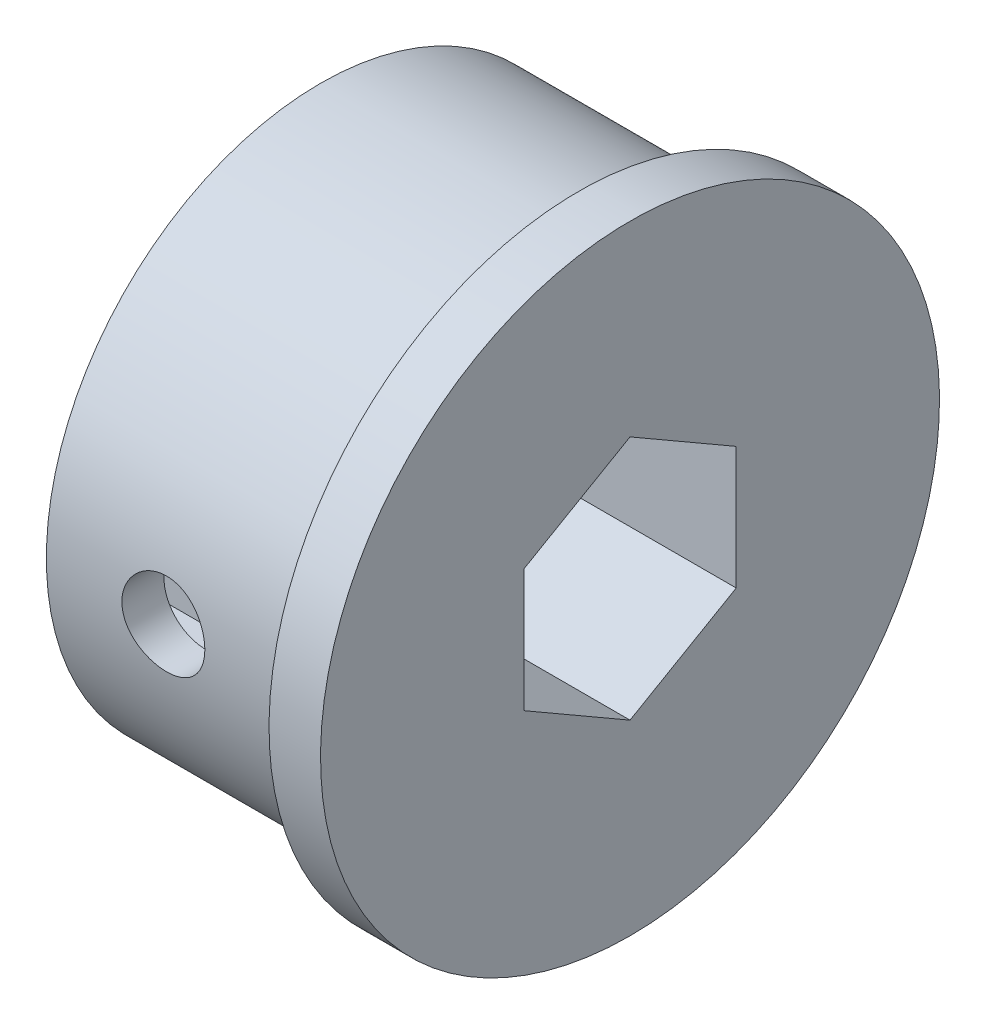
ISO-10303-21;
HEADER;
FILE_DESCRIPTION(('STEP AP214'),'2;1');
FILE_NAME('part.step','',(''),(''),'','','');
FILE_SCHEMA(('AUTOMOTIVE_DESIGN { 1 0 10303 214 1 1 1 1 }'));
ENDSEC;
DATA;
#1=APPLICATION_CONTEXT('core data for automotive mechanical design processes');
#2=APPLICATION_PROTOCOL_DEFINITION('international standard','automotive_design',2000,#1);
#3=PRODUCT_CONTEXT('',#1,'mechanical');
#4=PRODUCT('Part','Part','',(#3));
#5=PRODUCT_RELATED_PRODUCT_CATEGORY('part','',(#4));
#6=PRODUCT_DEFINITION_FORMATION('','',#4);
#7=PRODUCT_DEFINITION_CONTEXT('part definition',#1,'design');
#8=PRODUCT_DEFINITION('design','',#6,#7);
#9=PRODUCT_DEFINITION_SHAPE('','',#8);
#10=(LENGTH_UNIT() NAMED_UNIT(*) SI_UNIT(.MILLI.,.METRE.));
#11=(NAMED_UNIT(*) PLANE_ANGLE_UNIT() SI_UNIT($,.RADIAN.));
#12=(NAMED_UNIT(*) SI_UNIT($,.STERADIAN.) SOLID_ANGLE_UNIT());
#13=UNCERTAINTY_MEASURE_WITH_UNIT(LENGTH_MEASURE(1.E-05),#10,'distance_accuracy_value','');
#14=(GEOMETRIC_REPRESENTATION_CONTEXT(3) GLOBAL_UNCERTAINTY_ASSIGNED_CONTEXT((#13)) GLOBAL_UNIT_ASSIGNED_CONTEXT((#10,
#11,#12)) REPRESENTATION_CONTEXT('',''));
#15=CARTESIAN_POINT('',(0.,0.,0.));
#16=DIRECTION('',(0.,0.,1.));
#17=DIRECTION('',(1.,0.,0.));
#18=AXIS2_PLACEMENT_3D('',#15,#16,#17);
#19=CARTESIAN_POINT('',(300.0375,80.0723576755287,527.049999999889));
#20=DIRECTION('',(-1.,0.,0.));
#21=DIRECTION('',(0.,1.,0.));
#22=AXIS2_PLACEMENT_3D('',#19,#20,#21);
#23=PLANE('',#22);
#24=DIRECTION('',(0.,0.500000000000001,0.866025403784438));
#25=VECTOR('',#24,1.);
#26=CARTESIAN_POINT('',(300.0375,72.5235029059326,527.049999999889));
#27=LINE('',#26,#25);
#28=CARTESIAN_POINT('',(300.0375,72.5235029059326,527.049999999889));
#29=VERTEX_POINT('',#28);
#30=CARTESIAN_POINT('',(300.0375,76.2979302907306,533.587499999839));
#31=VERTEX_POINT('',#30);
#32=EDGE_CURVE('E66',#29,#31,#27,.T.);
#33=ORIENTED_EDGE('',*,*,#32,.F.);
#34=DIRECTION('',(0.,-0.499999999999999,0.866025403784439));
#35=VECTOR('',#34,1.);
#36=CARTESIAN_POINT('',(300.0375,76.2979302907307,520.51249999994));
#37=LINE('',#36,#35);
#38=CARTESIAN_POINT('',(300.0375,76.2979302907307,520.51249999994));
#39=VERTEX_POINT('',#38);
#40=EDGE_CURVE('E174',#39,#29,#37,.T.);
#41=ORIENTED_EDGE('',*,*,#40,.F.);
#42=DIRECTION('',(0.,-1.,0.));
#43=VECTOR('',#42,1.);
#44=CARTESIAN_POINT('',(300.0375,83.8467850603268,520.51249999994));
#45=LINE('',#44,#43);
#46=CARTESIAN_POINT('',(300.0375,83.8467850603268,520.51249999994));
#47=VERTEX_POINT('',#46);
#48=EDGE_CURVE('E180',#47,#39,#45,.T.);
#49=ORIENTED_EDGE('',*,*,#48,.F.);
#50=DIRECTION('',(0.,-0.499999999999999,-0.866025403784439));
#51=VECTOR('',#50,1.);
#52=CARTESIAN_POINT('',(300.0375,87.6212124451248,527.049999999889));
#53=LINE('',#52,#51);
#54=CARTESIAN_POINT('',(300.0375,87.6212124451248,527.049999999889));
#55=VERTEX_POINT('',#54);
#56=EDGE_CURVE('E203',#55,#47,#53,.T.);
#57=ORIENTED_EDGE('',*,*,#56,.F.);
#58=DIRECTION('',(0.,0.500000000000001,-0.866025403784438));
#59=VECTOR('',#58,1.);
#60=CARTESIAN_POINT('',(300.0375,83.8467850603268,533.587499999839));
#61=LINE('',#60,#59);
#62=CARTESIAN_POINT('',(300.0375,83.8467850603268,533.587499999839));
#63=VERTEX_POINT('',#62);
#64=EDGE_CURVE('E199',#63,#55,#61,.T.);
#65=ORIENTED_EDGE('',*,*,#64,.F.);
#66=DIRECTION('',(0.,1.,0.));
#67=VECTOR('',#66,1.);
#68=CARTESIAN_POINT('',(300.0375,76.2979302907306,533.587499999839));
#69=LINE('',#68,#67);
#70=EDGE_CURVE('E196',#31,#63,#69,.T.);
#71=ORIENTED_EDGE('',*,*,#70,.F.);
#72=EDGE_LOOP('',(#33,#41,#49,#57,#65,#71));
#73=FACE_BOUND('',#72,.T.);
#74=DIRECTION('',(0.,0.,1.));
#75=VECTOR('',#74,1.);
#76=CARTESIAN_POINT('',(300.0375,75.2223576755286,514.549999999889));
#77=LINE('',#76,#75);
#78=CARTESIAN_POINT('',(300.0375,75.2223576755286,512.762499999889));
#79=VERTEX_POINT('',#78);
#80=CARTESIAN_POINT('',(300.0375,75.2223576755286,516.337499999889));
#81=VERTEX_POINT('',#80);
#82=EDGE_CURVE('E334',#79,#81,#77,.T.);
#83=ORIENTED_EDGE('',*,*,#82,.F.);
#84=DIRECTION('',(0.,1.,0.));
#85=VECTOR('',#84,1.);
#86=CARTESIAN_POINT('',(300.0375,80.0723576755286,512.762499999889));
#87=LINE('',#86,#85);
#88=CARTESIAN_POINT('',(300.0375,84.9223576755286,512.762499999889));
#89=VERTEX_POINT('',#88);
#90=EDGE_CURVE('E315',#79,#89,#87,.T.);
#91=ORIENTED_EDGE('',*,*,#90,.T.);
#92=DIRECTION('',(0.,0.,1.));
#93=VECTOR('',#92,1.);
#94=CARTESIAN_POINT('',(300.0375,84.9223576755286,514.549999999889));
#95=LINE('',#94,#93);
#96=CARTESIAN_POINT('',(300.0375,84.9223576755286,516.337499999889));
#97=VERTEX_POINT('',#96);
#98=EDGE_CURVE('E327',#89,#97,#95,.T.);
#99=ORIENTED_EDGE('',*,*,#98,.T.);
#100=DIRECTION('',(0.,1.,0.));
#101=VECTOR('',#100,1.);
#102=CARTESIAN_POINT('',(300.0375,80.0723576755286,516.337499999889));
#103=LINE('',#102,#101);
#104=EDGE_CURVE('E331',#81,#97,#103,.T.);
#105=ORIENTED_EDGE('',*,*,#104,.F.);
#106=EDGE_LOOP('',(#83,#91,#99,#105));
#107=FACE_BOUND('',#106,.T.);
#108=DIRECTION('',(0.,1.,0.));
#109=VECTOR('',#108,1.);
#110=CARTESIAN_POINT('',(300.0375,80.0723576755286,541.337499999889));
#111=LINE('',#110,#109);
#112=CARTESIAN_POINT('',(300.0375,75.2223576755283,541.337499999889));
#113=VERTEX_POINT('',#112);
#114=CARTESIAN_POINT('',(300.0375,84.9223576755283,541.337499999889));
#115=VERTEX_POINT('',#114);
#116=EDGE_CURVE('E369',#113,#115,#111,.T.);
#117=ORIENTED_EDGE('',*,*,#116,.F.);
#118=DIRECTION('',(0.,0.,-1.));
#119=VECTOR('',#118,1.);
#120=CARTESIAN_POINT('',(300.0375,75.2223576755283,539.549999999889));
#121=LINE('',#120,#119);
#122=CARTESIAN_POINT('',(300.0375,75.2223576755286,537.762499999889));
#123=VERTEX_POINT('',#122);
#124=EDGE_CURVE('E307',#113,#123,#121,.T.);
#125=ORIENTED_EDGE('',*,*,#124,.T.);
#126=DIRECTION('',(0.,1.,0.));
#127=VECTOR('',#126,1.);
#128=CARTESIAN_POINT('',(300.0375,80.0723576755286,537.762499999889));
#129=LINE('',#128,#127);
#130=CARTESIAN_POINT('',(300.0375,84.9223576755287,537.762499999889));
#131=VERTEX_POINT('',#130);
#132=EDGE_CURVE('E354',#123,#131,#129,.T.);
#133=ORIENTED_EDGE('',*,*,#132,.T.);
#134=DIRECTION('',(0.,0.,-1.));
#135=VECTOR('',#134,1.);
#136=CARTESIAN_POINT('',(300.0375,84.9223576755283,539.549999999889));
#137=LINE('',#136,#135);
#138=EDGE_CURVE('E373',#115,#131,#137,.T.);
#139=ORIENTED_EDGE('',*,*,#138,.F.);
#140=EDGE_LOOP('',(#117,#125,#133,#139));
#141=FACE_BOUND('',#140,.T.);
#142=CARTESIAN_POINT('',(300.0375,80.0723576755287,527.049999999889));
#143=DIRECTION('',(-1.,0.,0.));
#144=DIRECTION('',(0.,-1.,0.));
#145=AXIS2_PLACEMENT_3D('',#142,#143,#144);
#146=CIRCLE('',#145,16.875);
#147=CARTESIAN_POINT('',(300.0375,63.1973576755287,527.049999999889));
#148=VERTEX_POINT('',#147);
#149=EDGE_CURVE('E230',#148,#148,#146,.T.);
#150=ORIENTED_EDGE('',*,*,#149,.T.);
#151=EDGE_LOOP('',(#150));
#152=FACE_BOUND('',#151,.T.);
#153=ADVANCED_FACE('F48',(#73,#107,#141,#152),#23,.T.);
#154=CARTESIAN_POINT('',(315.9125,80.0723576755287,527.049999999889));
#155=DIRECTION('',(1.,0.,0.));
#156=DIRECTION('',(0.,-1.,0.));
#157=AXIS2_PLACEMENT_3D('',#154,#155,#156);
#158=CYLINDRICAL_SURFACE('',#157,19.0500000001116);
#159=CARTESIAN_POINT('',(319.0875,80.0723576755287,527.049999999889));
#160=DIRECTION('',(1.,0.,0.));
#161=DIRECTION('',(0.,-1.,0.));
#162=AXIS2_PLACEMENT_3D('',#159,#160,#161);
#163=CIRCLE('',#162,19.0500000001116);
#164=CARTESIAN_POINT('',(319.0875,61.0223576754172,527.049999999889));
#165=VERTEX_POINT('',#164);
#166=EDGE_CURVE('E12',#165,#165,#163,.T.);
#167=ORIENTED_EDGE('',*,*,#166,.F.);
#168=EDGE_LOOP('',(#167));
#169=FACE_BOUND('',#168,.T.);
#170=CARTESIAN_POINT('',(315.9175,80.0723576755287,527.049999999889));
#171=DIRECTION('',(-1.,0.,0.));
#172=DIRECTION('',(0.,-1.,0.));
#173=AXIS2_PLACEMENT_3D('',#170,#171,#172);
#174=CIRCLE('',#173,19.0500000001116);
#175=CARTESIAN_POINT('',(315.9175,61.0223576754172,527.049999999889));
#176=VERTEX_POINT('',#175);
#177=EDGE_CURVE('E243',#176,#176,#174,.F.);
#178=ORIENTED_EDGE('',*,*,#177,.T.);
#179=EDGE_LOOP('',(#178));
#180=FACE_BOUND('',#179,.T.);
#181=ADVANCED_FACE('F50',(#169,#180),#158,.T.);
#182=CARTESIAN_POINT('',(307.238238685969,80.0723576755286,-1070.3213718366));
#183=DIRECTION('',(0.,0.,1.));
#184=DIRECTION('',(1.,0.,0.));
#185=AXIS2_PLACEMENT_3D('',#182,#183,#184);
#186=CYLINDRICAL_SURFACE('',#185,2.5527);
#187=CARTESIAN_POINT('',(307.238238685969,80.0723576755286,512.762499999889));
#188=DIRECTION('',(0.,0.,1.));
#189=DIRECTION('',(1.,0.,0.));
#190=AXIS2_PLACEMENT_3D('',#187,#188,#189);
#191=CIRCLE('',#190,2.5527);
#192=CARTESIAN_POINT('',(309.790938685969,80.0723576755286,512.762499999889));
#193=VERTEX_POINT('',#192);
#194=EDGE_CURVE('E244',#193,#193,#191,.F.);
#195=ORIENTED_EDGE('',*,*,#194,.F.);
#196=EDGE_LOOP('',(#195));
#197=FACE_BOUND('',#196,.T.);
#198=CARTESIAN_POINT('',(309.790938685969,80.0723576755286,510.174999999889));
#199=CARTESIAN_POINT('',(309.790932819891,79.9298437712358,510.175002297234));
#200=CARTESIAN_POINT('',(309.778963846414,79.7872475302025,510.176824263856));
#201=CARTESIAN_POINT('',(309.731416879008,79.5060418139082,510.183917091772));
#202=CARTESIAN_POINT('',(309.695815990232,79.3674363409473,510.189191297563));
#203=CARTESIAN_POINT('',(309.602094136938,79.0983223794356,510.202595984318));
#204=CARTESIAN_POINT('',(309.543990295799,78.9678078215814,510.210724293045));
#205=CARTESIAN_POINT('',(309.406953957554,78.7184008107214,510.228939334257));
#206=CARTESIAN_POINT('',(309.328024315861,78.5995067674932,510.239025798211));
#207=CARTESIAN_POINT('',(309.150909265625,78.375752092096,510.260125306513));
#208=CARTESIAN_POINT('',(309.052591122191,78.270997088677,510.271144421028));
#209=CARTESIAN_POINT('',(308.839775594758,78.0794055258222,510.292819872713));
#210=CARTESIAN_POINT('',(308.725277274452,77.9925700040598,510.303476188845));
#211=CARTESIAN_POINT('',(308.482640703871,77.8388702726055,510.323278397501));
#212=CARTESIAN_POINT('',(308.354436914671,77.7721084268976,510.332416445387));
#213=CARTESIAN_POINT('',(308.08847435423,77.6611053705987,510.34806451032));
#214=CARTESIAN_POINT('',(307.950716113198,77.6168629114664,510.35457467306));
#215=CARTESIAN_POINT('',(307.670666640685,77.5524829021332,510.364170139698));
#216=CARTESIAN_POINT('',(307.528417903986,77.5321644020411,510.367281140216));
#217=CARTESIAN_POINT('',(307.242498538485,77.5156484784942,510.369804039997));
#218=CARTESIAN_POINT('',(307.098827993183,77.5194496468149,510.369216155219));
#219=CARTESIAN_POINT('',(306.815422521982,77.5509173183914,510.364431202666));
#220=CARTESIAN_POINT('',(306.675664615773,77.5783821614887,510.360264633124));
#221=CARTESIAN_POINT('',(306.402763884487,77.6560818199842,510.348839428989));
#222=CARTESIAN_POINT('',(306.26962124958,77.7063172895482,510.341580705564));
#223=CARTESIAN_POINT('',(306.01311764744,77.8283415550065,510.32475543706));
#224=CARTESIAN_POINT('',(305.889797878684,77.9002156464006,510.315179788964));
#225=CARTESIAN_POINT('',(305.656892856638,78.0634161818976,510.294806168011));
#226=CARTESIAN_POINT('',(305.547308520656,78.154743924096,510.284008113608));
#227=CARTESIAN_POINT('',(305.343816421024,78.3553656478616,510.262271654448));
#228=CARTESIAN_POINT('',(305.250079515528,78.4648329840202,510.251332939572));
#229=CARTESIAN_POINT('',(305.082281367194,78.6980360122072,510.230649683749));
#230=CARTESIAN_POINT('',(305.008220213191,78.8217717686521,510.220905148195));
#231=CARTESIAN_POINT('',(304.881866612394,79.0801482458475,510.203697763207));
#232=CARTESIAN_POINT('',(304.829587487418,79.2147955801348,510.196236310838));
#233=CARTESIAN_POINT('',(304.748431226632,79.4910966624699,510.184447443382));
#234=CARTESIAN_POINT('',(304.719552481549,79.6327499279998,510.18011981278));
#235=CARTESIAN_POINT('',(304.68624425964,79.9175673724604,510.175114771622));
#236=CARTESIAN_POINT('',(304.681579912238,80.0607034906886,510.174402296945));
#237=CARTESIAN_POINT('',(304.696209268901,80.3457137768306,510.176612353537));
#238=CARTESIAN_POINT('',(304.715502218283,80.4875879843542,510.179534770303));
#239=CARTESIAN_POINT('',(304.777303203345,80.7653347121381,510.188664553935));
#240=CARTESIAN_POINT('',(304.819696676856,80.9012333022143,510.19485570553));
#241=CARTESIAN_POINT('',(304.92637440793,81.1639938344663,510.209831052095));
#242=CARTESIAN_POINT('',(304.990659708633,81.2908553456792,510.218615370626));
#243=CARTESIAN_POINT('',(305.139846337428,81.5329724505116,510.237888116534));
#244=CARTESIAN_POINT('',(305.224896487304,81.6481353618699,510.248388655951));
#245=CARTESIAN_POINT('',(305.412991534752,81.8626371727845,510.269887757208));
#246=CARTESIAN_POINT('',(305.516037496912,81.96197513551,510.280886348483));
#247=CARTESIAN_POINT('',(305.738245248006,82.1428629870984,510.302253288083));
#248=CARTESIAN_POINT('',(305.857535956407,82.224255340391,510.312615519937));
#249=CARTESIAN_POINT('',(306.108234098609,82.3658461501206,510.331427729335));
#250=CARTESIAN_POINT('',(306.239641200549,82.4260451868124,510.339877759231));
#251=CARTESIAN_POINT('',(306.510374342314,82.5232969958589,510.353864429793));
#252=CARTESIAN_POINT('',(306.649670159998,82.5604323425807,510.359411452664));
#253=CARTESIAN_POINT('',(306.932611723402,82.6107652365089,510.366991551005));
#254=CARTESIAN_POINT('',(307.076257162432,82.6239644674599,510.36902487364));
#255=CARTESIAN_POINT('',(307.362249989582,82.6260098923004,510.369338018507));
#256=CARTESIAN_POINT('',(307.50459562602,82.615103804564,510.367656021345));
#257=CARTESIAN_POINT('',(307.785403375964,82.5697793728117,510.360811075055));
#258=CARTESIAN_POINT('',(307.92386549612,82.5353610690595,510.355648131888));
#259=CARTESIAN_POINT('',(308.192905148712,82.4440773503966,510.342436460551));
#260=CARTESIAN_POINT('',(308.323488773583,82.3872295435067,510.334389996509));
#261=CARTESIAN_POINT('',(308.573305052095,82.2527252254159,510.31631520349));
#262=CARTESIAN_POINT('',(308.692537308014,82.1750679854693,510.306286805109));
#263=CARTESIAN_POINT('',(308.917524346738,82.0002503761799,510.285255461089));
#264=CARTESIAN_POINT('',(309.023135855259,81.9029066255211,510.274243940615));
#265=CARTESIAN_POINT('',(309.216612527904,81.6918667621817,510.25255842276));
#266=CARTESIAN_POINT('',(309.30447356396,81.5781668561982,510.241884504378));
#267=CARTESIAN_POINT('',(309.460395828785,81.3368921094776,510.222008458835));
#268=CARTESIAN_POINT('',(309.52834336317,81.2092430982711,510.212814913044));
#269=CARTESIAN_POINT('',(309.641731962398,80.9442647947181,510.197019568045));
#270=CARTESIAN_POINT('',(309.687196272251,80.806945668697,510.190415093512));
#271=CARTESIAN_POINT('',(309.744046175688,80.5695733906038,510.182044785045));
#272=CARTESIAN_POINT('',(309.76160389931,80.4709833976398,510.17941659861));
#273=CARTESIAN_POINT('',(309.785052138971,80.2723950067026,510.175893410756));
#274=CARTESIAN_POINT('',(309.790942803717,80.1723966266969,510.174998387246));
#275=CARTESIAN_POINT('',(309.790938685969,80.0723576755286,510.174999999889));
#276=B_SPLINE_CURVE_WITH_KNOTS('',3,(#198,#199,#200,#201,#202,#203,#204,#205,#206,#207,#208,
#209,#210,#211,#212,#213,#214,#215,#216,#217,#218,#219,#220,#221,#222,#223,#224,#225,#226,#227,
#228,#229,#230,#231,#232,#233,#234,#235,#236,#237,#238,#239,#240,#241,#242,#243,#244,#245,#246,
#247,#248,#249,#250,#251,#252,#253,#254,#255,#256,#257,#258,#259,#260,#261,#262,#263,#264,#265,
#266,#267,#268,#269,#270,#271,#272,#273,#274,#275),.UNSPECIFIED.,.T.,.F.,(4,2,2,2,2,2,2,2,2,2,2,
2,2,2,2,2,2,2,2,2,2,2,2,2,2,2,2,2,2,2,2,2,2,2,2,2,2,2,4),(0.,0.427176151096494,
0.854766760112246,1.28203263591079,1.70923995992201,2.13948040383623,2.56974575493776,
3.00216938059376,3.43456902879085,3.86367675546901,4.29275942896751,4.71822125506837,
5.14369530482369,5.57086895686391,5.99807112211297,6.42962015755245,6.86117114135242,
7.29298567426256,7.72477050820891,8.15235925926199,8.57993454111669,9.00540840088621,
9.43090253721337,9.85954064458187,10.2882041177349,10.7204927338968,11.152769513445,
11.5834895637748,12.0141793146736,12.4404636791415,12.8667473136167,13.2926969628081,
13.718661530694,14.1487936545706,14.5790256955597,15.0116682809348,15.4438626247118,
15.7437266907839,16.0435869348202),.UNSPECIFIED.);
#277=CARTESIAN_POINT('',(309.790938685969,80.0723576755286,510.174999999889));
#278=VERTEX_POINT('',#277);
#279=EDGE_CURVE('E234',#278,#278,#276,.T.);
#280=ORIENTED_EDGE('',*,*,#279,.T.);
#281=EDGE_LOOP('',(#280));
#282=FACE_BOUND('',#281,.T.);
#283=ADVANCED_FACE('F286',(#197,#282),#186,.F.);
#284=CARTESIAN_POINT('',(307.238238685969,80.0723576755286,541.337499999889));
#285=DIRECTION('',(0.,0.,1.));
#286=DIRECTION('',(1.,0.,0.));
#287=AXIS2_PLACEMENT_3D('',#284,#285,#286);
#288=CIRCLE('',#287,2.5527);
#289=CARTESIAN_POINT('',(309.790938685969,80.0723576755286,541.337499999889));
#290=VERTEX_POINT('',#289);
#291=EDGE_CURVE('E302',#290,#290,#288,.F.);
#292=ORIENTED_EDGE('',*,*,#291,.T.);
#293=EDGE_LOOP('',(#292));
#294=FACE_BOUND('',#293,.T.);
#295=CARTESIAN_POINT('',(309.790938685969,80.0723576755286,543.924999999889));
#296=CARTESIAN_POINT('',(309.790932819891,80.2148715798214,543.924997702544));
#297=CARTESIAN_POINT('',(309.778963846414,80.3574678208547,543.923175735922));
#298=CARTESIAN_POINT('',(309.731416879008,80.638673537149,543.916082908006));
#299=CARTESIAN_POINT('',(309.695815990232,80.7772790101099,543.910808702215));
#300=CARTESIAN_POINT('',(309.602094136938,81.0463929716216,543.89740401546));
#301=CARTESIAN_POINT('',(309.543990295799,81.1769075294758,543.889275706733));
#302=CARTESIAN_POINT('',(309.406953957554,81.4263145403359,543.871060665521));
#303=CARTESIAN_POINT('',(309.328024315861,81.5452085835641,543.860974201567));
#304=CARTESIAN_POINT('',(309.150909265625,81.7689632589612,543.839874693265));
#305=CARTESIAN_POINT('',(309.052591122191,81.8737182623802,543.82885557875));
#306=CARTESIAN_POINT('',(308.839775594758,82.065309825235,543.807180127065));
#307=CARTESIAN_POINT('',(308.725277274452,82.1521453469974,543.796523810933));
#308=CARTESIAN_POINT('',(308.482640703871,82.3058450784517,543.776721602277));
#309=CARTESIAN_POINT('',(308.354436914671,82.3726069241596,543.767583554391));
#310=CARTESIAN_POINT('',(308.08847435423,82.4836099804585,543.751935489458));
#311=CARTESIAN_POINT('',(307.950716113198,82.5278524395908,543.745425326718));
#312=CARTESIAN_POINT('',(307.670666640685,82.592232448924,543.73582986008));
#313=CARTESIAN_POINT('',(307.528417903986,82.6125509490161,543.732718859562));
#314=CARTESIAN_POINT('',(307.242498538485,82.629066872563,543.730195959781));
#315=CARTESIAN_POINT('',(307.098827993183,82.6252657042423,543.730783844559));
#316=CARTESIAN_POINT('',(306.815422521982,82.5937980326659,543.735568797112));
#317=CARTESIAN_POINT('',(306.675664615773,82.5663331895685,543.739735366654));
#318=CARTESIAN_POINT('',(306.402763884487,82.488633531073,543.751160570789));
#319=CARTESIAN_POINT('',(306.26962124958,82.438398061509,543.758419294214));
#320=CARTESIAN_POINT('',(306.01311764744,82.3163737960507,543.775244562718));
#321=CARTESIAN_POINT('',(305.889797878684,82.2444997046566,543.784820210814));
#322=CARTESIAN_POINT('',(305.656892856638,82.0812991691596,543.805193831767));
#323=CARTESIAN_POINT('',(305.547308520656,81.9899714269612,543.81599188617));
#324=CARTESIAN_POINT('',(305.343816421024,81.7893497031956,543.83772834533));
#325=CARTESIAN_POINT('',(305.250079515528,81.679882367037,543.848667060206));
#326=CARTESIAN_POINT('',(305.082281367194,81.44667933885,543.869350316029));
#327=CARTESIAN_POINT('',(305.008220213191,81.3229435824051,543.879094851583));
#328=CARTESIAN_POINT('',(304.881866612394,81.0645671052097,543.896302236571));
#329=CARTESIAN_POINT('',(304.829587487418,80.9299197709224,543.90376368894));
#330=CARTESIAN_POINT('',(304.748431226632,80.6536186885873,543.915552556397));
#331=CARTESIAN_POINT('',(304.719552481549,80.5119654230574,543.919880186998));
#332=CARTESIAN_POINT('',(304.68624425964,80.2271479785968,543.924885228156));
#333=CARTESIAN_POINT('',(304.681579912238,80.0840118603686,543.925597702833));
#334=CARTESIAN_POINT('',(304.696209268901,79.7990015742266,543.923387646241));
#335=CARTESIAN_POINT('',(304.715502218283,79.657127366703,543.920465229475));
#336=CARTESIAN_POINT('',(304.777303203345,79.3793806389191,543.911335445843));
#337=CARTESIAN_POINT('',(304.819696676856,79.2434820488429,543.905144294248));
#338=CARTESIAN_POINT('',(304.92637440793,78.9807215165909,543.890168947683));
#339=CARTESIAN_POINT('',(304.990659708633,78.853860005378,543.881384629152));
#340=CARTESIAN_POINT('',(305.139846337428,78.6117429005456,543.862111883244));
#341=CARTESIAN_POINT('',(305.224896487304,78.4965799891873,543.851611343827));
#342=CARTESIAN_POINT('',(305.412991534752,78.2820781782727,543.83011224257));
#343=CARTESIAN_POINT('',(305.516037496912,78.1827402155472,543.819113651295));
#344=CARTESIAN_POINT('',(305.738245248006,78.0018523639588,543.797746711695));
#345=CARTESIAN_POINT('',(305.857535956407,77.9204600106662,543.787384479841));
#346=CARTESIAN_POINT('',(306.108234098609,77.7788692009366,543.768572270443));
#347=CARTESIAN_POINT('',(306.239641200549,77.7186701642448,543.760122240547));
#348=CARTESIAN_POINT('',(306.510374342314,77.6214183551983,543.746135569985));
#349=CARTESIAN_POINT('',(306.649670159998,77.5842830084765,543.740588547114));
#350=CARTESIAN_POINT('',(306.932611723402,77.5339501145483,543.733008448773));
#351=CARTESIAN_POINT('',(307.076257162432,77.5207508835973,543.730975126138));
#352=CARTESIAN_POINT('',(307.362249989582,77.5187054587568,543.730661981271));
#353=CARTESIAN_POINT('',(307.50459562602,77.5296115464933,543.732343978432));
#354=CARTESIAN_POINT('',(307.785403375964,77.5749359782455,543.739188924723));
#355=CARTESIAN_POINT('',(307.92386549612,77.6093542819977,543.74435186789));
#356=CARTESIAN_POINT('',(308.192905148712,77.7006380006606,543.757563539227));
#357=CARTESIAN_POINT('',(308.323488773583,77.7574858075505,543.765610003269));
#358=CARTESIAN_POINT('',(308.573305052095,77.8919901256413,543.783684796288));
#359=CARTESIAN_POINT('',(308.692537308014,77.9696473655879,543.793713194669));
#360=CARTESIAN_POINT('',(308.917524346738,78.1444649748773,543.814744538689));
#361=CARTESIAN_POINT('',(309.023135855259,78.2418087255361,543.825756059163));
#362=CARTESIAN_POINT('',(309.216612527904,78.4528485888755,543.847441577018));
#363=CARTESIAN_POINT('',(309.30447356396,78.566548494859,543.8581154954));
#364=CARTESIAN_POINT('',(309.460395828785,78.8078232415796,543.877991540943));
#365=CARTESIAN_POINT('',(309.52834336317,78.9354722527861,543.887185086734));
#366=CARTESIAN_POINT('',(309.641731962398,79.2004505563391,543.902980431733));
#367=CARTESIAN_POINT('',(309.687196272251,79.3377696823603,543.909584906266));
#368=CARTESIAN_POINT('',(309.744046175688,79.5751419604534,543.917955214733));
#369=CARTESIAN_POINT('',(309.76160389931,79.6737319534174,543.920583401168));
#370=CARTESIAN_POINT('',(309.785052138971,79.8723203443545,543.924106589022));
#371=CARTESIAN_POINT('',(309.790942803717,79.9723187243603,543.925001612532));
#372=CARTESIAN_POINT('',(309.790938685969,80.0723576755286,543.924999999889));
#373=B_SPLINE_CURVE_WITH_KNOTS('',3,(#295,#296,#297,#298,#299,#300,#301,#302,#303,#304,#305,
#306,#307,#308,#309,#310,#311,#312,#313,#314,#315,#316,#317,#318,#319,#320,#321,#322,#323,#324,
#325,#326,#327,#328,#329,#330,#331,#332,#333,#334,#335,#336,#337,#338,#339,#340,#341,#342,#343,
#344,#345,#346,#347,#348,#349,#350,#351,#352,#353,#354,#355,#356,#357,#358,#359,#360,#361,#362,
#363,#364,#365,#366,#367,#368,#369,#370,#371,#372),.UNSPECIFIED.,.T.,.F.,(4,2,2,2,2,2,2,2,2,2,2,
2,2,2,2,2,2,2,2,2,2,2,2,2,2,2,2,2,2,2,2,2,2,2,2,2,2,2,4),(0.,0.427176151096494,
0.854766760112246,1.28203263591082,1.70923995992201,2.13948040383623,2.56974575493776,
3.00216938059376,3.43456902879085,3.86367675546906,4.29275942896751,4.71822125506837,
5.14369530482369,5.57086895686396,5.99807112211297,6.42962015755248,6.86117114135243,
7.29298567426255,7.72477050820891,8.15235925926202,8.57993454111669,9.00540840088621,
9.43090253721338,9.85954064458189,10.2882041177349,10.7204927338968,11.152769513445,
11.5834895637748,12.0141793146736,12.4404636791415,12.8667473136167,13.2926969628082,
13.718661530694,14.1487936545706,14.5790256955597,15.0116682809348,15.4438626247118,
15.7437266907839,16.0435869348202),.UNSPECIFIED.);
#374=CARTESIAN_POINT('',(309.790938685969,80.0723576755286,543.924999999889));
#375=VERTEX_POINT('',#374);
#376=EDGE_CURVE('E229',#375,#375,#373,.T.);
#377=ORIENTED_EDGE('',*,*,#376,.T.);
#378=EDGE_LOOP('',(#377));
#379=FACE_BOUND('',#378,.T.);
#380=ADVANCED_FACE('F427',(#294,#379),#186,.F.);
#381=CARTESIAN_POINT('',(319.0875,180.610602461199,621.294901659238));
#382=DIRECTION('',(-1.,0.,0.));
#383=DIRECTION('',(0.,1.,0.));
#384=AXIS2_PLACEMENT_3D('',#381,#382,#383);
#385=PLANE('',#384);
#386=DIRECTION('',(0.,-0.499999999999999,0.866025403784439));
#387=VECTOR('',#386,1.);
#388=CARTESIAN_POINT('',(319.0875,76.2979302907307,520.51249999994));
#389=LINE('',#388,#387);
#390=CARTESIAN_POINT('',(319.0875,76.2979302907307,520.51249999994));
#391=VERTEX_POINT('',#390);
#392=CARTESIAN_POINT('',(319.0875,72.5235029059326,527.049999999889));
#393=VERTEX_POINT('',#392);
#394=EDGE_CURVE('E161',#391,#393,#389,.T.);
#395=ORIENTED_EDGE('',*,*,#394,.T.);
#396=DIRECTION('',(0.,0.500000000000001,0.866025403784438));
#397=VECTOR('',#396,1.);
#398=CARTESIAN_POINT('',(319.0875,72.5235029059326,527.049999999889));
#399=LINE('',#398,#397);
#400=CARTESIAN_POINT('',(319.0875,76.2979302907306,533.587499999839));
#401=VERTEX_POINT('',#400);
#402=EDGE_CURVE('E154',#393,#401,#399,.T.);
#403=ORIENTED_EDGE('',*,*,#402,.T.);
#404=DIRECTION('',(0.,1.,0.));
#405=VECTOR('',#404,1.);
#406=CARTESIAN_POINT('',(319.0875,76.2979302907306,533.587499999839));
#407=LINE('',#406,#405);
#408=CARTESIAN_POINT('',(319.0875,83.8467850603268,533.587499999839));
#409=VERTEX_POINT('',#408);
#410=EDGE_CURVE('E164',#401,#409,#407,.T.);
#411=ORIENTED_EDGE('',*,*,#410,.T.);
#412=DIRECTION('',(0.,0.500000000000001,-0.866025403784438));
#413=VECTOR('',#412,1.);
#414=CARTESIAN_POINT('',(319.0875,83.8467850603268,533.587499999839));
#415=LINE('',#414,#413);
#416=CARTESIAN_POINT('',(319.0875,87.6212124451248,527.049999999889));
#417=VERTEX_POINT('',#416);
#418=EDGE_CURVE('E74',#409,#417,#415,.T.);
#419=ORIENTED_EDGE('',*,*,#418,.T.);
#420=DIRECTION('',(0.,-0.499999999999999,-0.866025403784439));
#421=VECTOR('',#420,1.);
#422=CARTESIAN_POINT('',(319.0875,87.6212124451248,527.049999999889));
#423=LINE('',#422,#421);
#424=CARTESIAN_POINT('',(319.0875,83.8467850603268,520.51249999994));
#425=VERTEX_POINT('',#424);
#426=EDGE_CURVE('E185',#417,#425,#423,.T.);
#427=ORIENTED_EDGE('',*,*,#426,.T.);
#428=DIRECTION('',(0.,-1.,0.));
#429=VECTOR('',#428,1.);
#430=CARTESIAN_POINT('',(319.0875,83.8467850603268,520.51249999994));
#431=LINE('',#430,#429);
#432=EDGE_CURVE('E189',#425,#391,#431,.T.);
#433=ORIENTED_EDGE('',*,*,#432,.T.);
#434=EDGE_LOOP('',(#395,#403,#411,#419,#427,#433));
#435=FACE_BOUND('',#434,.T.);
#436=ORIENTED_EDGE('',*,*,#166,.T.);
#437=EDGE_LOOP('',(#436));
#438=FACE_BOUND('',#437,.T.);
#439=ADVANCED_FACE('F169',(#435,#438),#385,.F.);
#440=CARTESIAN_POINT('',(312.7375,75.2223576755283,539.549999999889));
#441=DIRECTION('',(0.,1.,0.));
#442=DIRECTION('',(1.,0.,0.));
#443=AXIS2_PLACEMENT_3D('',#440,#441,#442);
#444=PLANE('',#443);
#445=ORIENTED_EDGE('',*,*,#124,.F.);
#446=DIRECTION('',(-1.,0.,0.));
#447=VECTOR('',#446,1.);
#448=CARTESIAN_POINT('',(312.7375,75.2223576755283,541.337499999889));
#449=LINE('',#448,#447);
#450=CARTESIAN_POINT('',(312.7375,75.2223576755283,541.337499999889));
#451=VERTEX_POINT('',#450);
#452=EDGE_CURVE('E332',#451,#113,#449,.T.);
#453=ORIENTED_EDGE('',*,*,#452,.F.);
#454=DIRECTION('',(0.,0.,-1.));
#455=VECTOR('',#454,1.);
#456=CARTESIAN_POINT('',(312.7375,75.2223576755283,539.549999999889));
#457=LINE('',#456,#455);
#458=CARTESIAN_POINT('',(312.7375,75.2223576755286,537.762499999889));
#459=VERTEX_POINT('',#458);
#460=EDGE_CURVE('E349',#451,#459,#457,.T.);
#461=ORIENTED_EDGE('',*,*,#460,.T.);
#462=DIRECTION('',(-1.,0.,0.));
#463=VECTOR('',#462,1.);
#464=CARTESIAN_POINT('',(312.7375,75.2223576755286,537.762499999889));
#465=LINE('',#464,#463);
#466=EDGE_CURVE('E366',#459,#123,#465,.T.);
#467=ORIENTED_EDGE('',*,*,#466,.T.);
#468=EDGE_LOOP('',(#445,#453,#461,#467));
#469=FACE_BOUND('',#468,.T.);
#470=ADVANCED_FACE('F395',(#469),#444,.T.);
#471=CARTESIAN_POINT('',(312.7375,80.0723576755286,541.337499999889));
#472=DIRECTION('',(0.,0.,1.));
#473=DIRECTION('',(1.,0.,0.));
#474=AXIS2_PLACEMENT_3D('',#471,#472,#473);
#475=PLANE('',#474);
#476=ORIENTED_EDGE('',*,*,#291,.F.);
#477=EDGE_LOOP('',(#476));
#478=FACE_BOUND('',#477,.T.);
#479=ORIENTED_EDGE('',*,*,#116,.T.);
#480=DIRECTION('',(-1.,0.,0.));
#481=VECTOR('',#480,1.);
#482=CARTESIAN_POINT('',(312.7375,84.9223576755283,541.337499999889));
#483=LINE('',#482,#481);
#484=CARTESIAN_POINT('',(312.7375,84.9223576755283,541.337499999889));
#485=VERTEX_POINT('',#484);
#486=EDGE_CURVE('E384',#485,#115,#483,.T.);
#487=ORIENTED_EDGE('',*,*,#486,.F.);
#488=DIRECTION('',(0.,1.,0.));
#489=VECTOR('',#488,1.);
#490=CARTESIAN_POINT('',(312.7375,80.0723576755286,541.337499999889));
#491=LINE('',#490,#489);
#492=EDGE_CURVE('E353',#451,#485,#491,.T.);
#493=ORIENTED_EDGE('',*,*,#492,.F.);
#494=ORIENTED_EDGE('',*,*,#452,.T.);
#495=EDGE_LOOP('',(#479,#487,#493,#494));
#496=FACE_BOUND('',#495,.T.);
#497=ADVANCED_FACE('F390',(#478,#496),#475,.F.);
#498=CARTESIAN_POINT('',(312.7375,84.9223576755283,539.549999999889));
#499=DIRECTION('',(0.,1.,0.));
#500=DIRECTION('',(1.,0.,0.));
#501=AXIS2_PLACEMENT_3D('',#498,#499,#500);
#502=PLANE('',#501);
#503=ORIENTED_EDGE('',*,*,#138,.T.);
#504=DIRECTION('',(-1.,0.,0.));
#505=VECTOR('',#504,1.);
#506=CARTESIAN_POINT('',(312.7375,84.9223576755287,537.762499999889));
#507=LINE('',#506,#505);
#508=CARTESIAN_POINT('',(312.7375,84.9223576755287,537.762499999889));
#509=VERTEX_POINT('',#508);
#510=EDGE_CURVE('E381',#509,#131,#507,.T.);
#511=ORIENTED_EDGE('',*,*,#510,.F.);
#512=DIRECTION('',(0.,0.,-1.));
#513=VECTOR('',#512,1.);
#514=CARTESIAN_POINT('',(312.7375,84.9223576755283,539.549999999889));
#515=LINE('',#514,#513);
#516=EDGE_CURVE('E358',#485,#509,#515,.T.);
#517=ORIENTED_EDGE('',*,*,#516,.F.);
#518=ORIENTED_EDGE('',*,*,#486,.T.);
#519=EDGE_LOOP('',(#503,#511,#517,#518));
#520=FACE_BOUND('',#519,.T.);
#521=ADVANCED_FACE('F400',(#520),#502,.F.);
#522=CARTESIAN_POINT('',(312.7375,80.0723576755286,537.762499999889));
#523=DIRECTION('',(0.,0.,1.));
#524=DIRECTION('',(1.,0.,0.));
#525=AXIS2_PLACEMENT_3D('',#522,#523,#524);
#526=PLANE('',#525);
#527=CARTESIAN_POINT('',(307.238238685969,80.0723576755286,537.762499999889));
#528=DIRECTION('',(0.,0.,1.));
#529=DIRECTION('',(1.,0.,0.));
#530=AXIS2_PLACEMENT_3D('',#527,#528,#529);
#531=CIRCLE('',#530,2.5527);
#532=CARTESIAN_POINT('',(309.790938685969,80.0723576755286,537.762499999889));
#533=VERTEX_POINT('',#532);
#534=EDGE_CURVE('E295',#533,#533,#531,.F.);
#535=ORIENTED_EDGE('',*,*,#534,.T.);
#536=EDGE_LOOP('',(#535));
#537=FACE_BOUND('',#536,.T.);
#538=ORIENTED_EDGE('',*,*,#132,.F.);
#539=ORIENTED_EDGE('',*,*,#466,.F.);
#540=DIRECTION('',(0.,1.,0.));
#541=VECTOR('',#540,1.);
#542=CARTESIAN_POINT('',(312.7375,80.0723576755286,537.762499999889));
#543=LINE('',#542,#541);
#544=EDGE_CURVE('E362',#459,#509,#543,.T.);
#545=ORIENTED_EDGE('',*,*,#544,.T.);
#546=ORIENTED_EDGE('',*,*,#510,.T.);
#547=EDGE_LOOP('',(#538,#539,#545,#546));
#548=FACE_BOUND('',#547,.T.);
#549=ADVANCED_FACE('F403',(#537,#548),#526,.T.);
#550=CARTESIAN_POINT('',(312.7375,80.0723576755287,527.049999999889));
#551=DIRECTION('',(-1.,0.,0.));
#552=DIRECTION('',(0.,1.,0.));
#553=AXIS2_PLACEMENT_3D('',#550,#551,#552);
#554=PLANE('',#553);
#555=ORIENTED_EDGE('',*,*,#460,.F.);
#556=ORIENTED_EDGE('',*,*,#492,.T.);
#557=ORIENTED_EDGE('',*,*,#516,.T.);
#558=ORIENTED_EDGE('',*,*,#544,.F.);
#559=EDGE_LOOP('',(#555,#556,#557,#558));
#560=FACE_BOUND('',#559,.T.);
#561=ADVANCED_FACE('F406',(#560),#554,.T.);
#562=CARTESIAN_POINT('',(312.7375,80.0723576755286,512.762499999889));
#563=DIRECTION('',(0.,0.,1.));
#564=DIRECTION('',(1.,0.,0.));
#565=AXIS2_PLACEMENT_3D('',#562,#563,#564);
#566=PLANE('',#565);
#567=ORIENTED_EDGE('',*,*,#194,.T.);
#568=EDGE_LOOP('',(#567));
#569=FACE_BOUND('',#568,.T.);
#570=ORIENTED_EDGE('',*,*,#90,.F.);
#571=DIRECTION('',(-1.,0.,0.));
#572=VECTOR('',#571,1.);
#573=CARTESIAN_POINT('',(312.7375,75.2223576755286,512.762499999889));
#574=LINE('',#573,#572);
#575=CARTESIAN_POINT('',(312.7375,75.2223576755286,512.762499999889));
#576=VERTEX_POINT('',#575);
#577=EDGE_CURVE('E58',#576,#79,#574,.T.);
#578=ORIENTED_EDGE('',*,*,#577,.F.);
#579=DIRECTION('',(0.,1.,0.));
#580=VECTOR('',#579,1.);
#581=CARTESIAN_POINT('',(312.7375,80.0723576755286,512.762499999889));
#582=LINE('',#581,#580);
#583=CARTESIAN_POINT('',(312.7375,84.9223576755286,512.762499999889));
#584=VERTEX_POINT('',#583);
#585=EDGE_CURVE('E323',#576,#584,#582,.T.);
#586=ORIENTED_EDGE('',*,*,#585,.T.);
#587=DIRECTION('',(-1.,0.,0.));
#588=VECTOR('',#587,1.);
#589=CARTESIAN_POINT('',(312.7375,84.9223576755286,512.762499999889));
#590=LINE('',#589,#588);
#591=EDGE_CURVE('E326',#584,#89,#590,.T.);
#592=ORIENTED_EDGE('',*,*,#591,.T.);
#593=EDGE_LOOP('',(#570,#578,#586,#592));
#594=FACE_BOUND('',#593,.T.);
#595=ADVANCED_FACE('F408',(#569,#594),#566,.T.);
#596=CARTESIAN_POINT('',(312.7375,75.2223576755286,514.549999999889));
#597=DIRECTION('',(0.,-1.,0.));
#598=DIRECTION('',(-1.,0.,0.));
#599=AXIS2_PLACEMENT_3D('',#596,#597,#598);
#600=PLANE('',#599);
#601=ORIENTED_EDGE('',*,*,#82,.T.);
#602=DIRECTION('',(-1.,0.,0.));
#603=VECTOR('',#602,1.);
#604=CARTESIAN_POINT('',(312.7375,75.2223576755286,516.337499999889));
#605=LINE('',#604,#603);
#606=CARTESIAN_POINT('',(312.7375,75.2223576755286,516.337499999889));
#607=VERTEX_POINT('',#606);
#608=EDGE_CURVE('E341',#607,#81,#605,.T.);
#609=ORIENTED_EDGE('',*,*,#608,.F.);
#610=DIRECTION('',(0.,0.,1.));
#611=VECTOR('',#610,1.);
#612=CARTESIAN_POINT('',(312.7375,75.2223576755286,514.549999999889));
#613=LINE('',#612,#611);
#614=EDGE_CURVE('E319',#576,#607,#613,.T.);
#615=ORIENTED_EDGE('',*,*,#614,.F.);
#616=ORIENTED_EDGE('',*,*,#577,.T.);
#617=EDGE_LOOP('',(#601,#609,#615,#616));
#618=FACE_BOUND('',#617,.T.);
#619=ADVANCED_FACE('F413',(#618),#600,.F.);
#620=CARTESIAN_POINT('',(312.7375,80.0723576755286,516.337499999889));
#621=DIRECTION('',(0.,0.,1.));
#622=DIRECTION('',(1.,0.,0.));
#623=AXIS2_PLACEMENT_3D('',#620,#621,#622);
#624=PLANE('',#623);
#625=CARTESIAN_POINT('',(307.238238685969,80.0723576755286,516.337499999889));
#626=DIRECTION('',(0.,0.,1.));
#627=DIRECTION('',(1.,0.,0.));
#628=AXIS2_PLACEMENT_3D('',#625,#626,#627);
#629=CIRCLE('',#628,2.5527);
#630=CARTESIAN_POINT('',(309.790938685969,80.0723576755286,516.337499999889));
#631=VERTEX_POINT('',#630);
#632=EDGE_CURVE('E266',#631,#631,#629,.F.);
#633=ORIENTED_EDGE('',*,*,#632,.F.);
#634=EDGE_LOOP('',(#633));
#635=FACE_BOUND('',#634,.T.);
#636=ORIENTED_EDGE('',*,*,#104,.T.);
#637=DIRECTION('',(-1.,0.,0.));
#638=VECTOR('',#637,1.);
#639=CARTESIAN_POINT('',(312.7375,84.9223576755286,516.337499999889));
#640=LINE('',#639,#638);
#641=CARTESIAN_POINT('',(312.7375,84.9223576755286,516.337499999889));
#642=VERTEX_POINT('',#641);
#643=EDGE_CURVE('E344',#642,#97,#640,.T.);
#644=ORIENTED_EDGE('',*,*,#643,.F.);
#645=DIRECTION('',(0.,1.,0.));
#646=VECTOR('',#645,1.);
#647=CARTESIAN_POINT('',(312.7375,80.0723576755286,516.337499999889));
#648=LINE('',#647,#646);
#649=EDGE_CURVE('E314',#607,#642,#648,.T.);
#650=ORIENTED_EDGE('',*,*,#649,.F.);
#651=ORIENTED_EDGE('',*,*,#608,.T.);
#652=EDGE_LOOP('',(#636,#644,#650,#651));
#653=FACE_BOUND('',#652,.T.);
#654=ADVANCED_FACE('F582',(#635,#653),#624,.F.);
#655=CARTESIAN_POINT('',(312.7375,84.9223576755286,514.549999999889));
#656=DIRECTION('',(0.,-1.,0.));
#657=DIRECTION('',(-1.,0.,0.));
#658=AXIS2_PLACEMENT_3D('',#655,#656,#657);
#659=PLANE('',#658);
#660=ORIENTED_EDGE('',*,*,#98,.F.);
#661=ORIENTED_EDGE('',*,*,#591,.F.);
#662=DIRECTION('',(0.,0.,1.));
#663=VECTOR('',#662,1.);
#664=CARTESIAN_POINT('',(312.7375,84.9223576755286,514.549999999889));
#665=LINE('',#664,#663);
#666=EDGE_CURVE('E310',#584,#642,#665,.T.);
#667=ORIENTED_EDGE('',*,*,#666,.T.);
#668=ORIENTED_EDGE('',*,*,#643,.T.);
#669=EDGE_LOOP('',(#660,#661,#667,#668));
#670=FACE_BOUND('',#669,.T.);
#671=ADVANCED_FACE('F577',(#670),#659,.T.);
#672=CARTESIAN_POINT('',(312.7375,80.0723576755287,527.049999999889));
#673=DIRECTION('',(-1.,0.,0.));
#674=DIRECTION('',(0.,1.,0.));
#675=AXIS2_PLACEMENT_3D('',#672,#673,#674);
#676=PLANE('',#675);
#677=ORIENTED_EDGE('',*,*,#585,.F.);
#678=ORIENTED_EDGE('',*,*,#614,.T.);
#679=ORIENTED_EDGE('',*,*,#649,.T.);
#680=ORIENTED_EDGE('',*,*,#666,.F.);
#681=EDGE_LOOP('',(#677,#678,#679,#680));
#682=FACE_BOUND('',#681,.T.);
#683=ADVANCED_FACE('F285',(#682),#676,.T.);
#684=CARTESIAN_POINT('',(307.238238685969,80.0723576755286,520.51249999994));
#685=DIRECTION('',(0.,0.,-1.));
#686=DIRECTION('',(-1.,0.,0.));
#687=AXIS2_PLACEMENT_3D('',#684,#685,#686);
#688=CIRCLE('',#687,2.5527);
#689=CARTESIAN_POINT('',(304.685538685969,80.0723576755286,520.51249999994));
#690=VERTEX_POINT('',#689);
#691=EDGE_CURVE('E52',#690,#690,#688,.T.);
#692=ORIENTED_EDGE('',*,*,#691,.F.);
#693=EDGE_LOOP('',(#692));
#694=FACE_BOUND('',#693,.T.);
#695=ORIENTED_EDGE('',*,*,#632,.T.);
#696=EDGE_LOOP('',(#695));
#697=FACE_BOUND('',#696,.T.);
#698=ADVANCED_FACE('F246',(#694,#697),#186,.F.);
#699=CARTESIAN_POINT('',(307.238238685969,80.0723576755286,533.587499999838));
#700=DIRECTION('',(0.,0.,1.));
#701=DIRECTION('',(1.,0.,0.));
#702=AXIS2_PLACEMENT_3D('',#699,#700,#701);
#703=CIRCLE('',#702,2.5527);
#704=CARTESIAN_POINT('',(309.790938685969,80.0723576755286,533.587499999838));
#705=VERTEX_POINT('',#704);
#706=EDGE_CURVE('E213',#705,#705,#703,.T.);
#707=ORIENTED_EDGE('',*,*,#706,.F.);
#708=EDGE_LOOP('',(#707));
#709=FACE_BOUND('',#708,.T.);
#710=ORIENTED_EDGE('',*,*,#534,.F.);
#711=EDGE_LOOP('',(#710));
#712=FACE_BOUND('',#711,.T.);
#713=ADVANCED_FACE('F284',(#709,#712),#186,.F.);
#714=CARTESIAN_POINT('',(315.9175,80.0723576755286,527.049999999889));
#715=DIRECTION('',(-1.,0.,0.));
#716=DIRECTION('',(0.,-1.,0.));
#717=AXIS2_PLACEMENT_3D('',#714,#715,#716);
#718=PLANE('',#717);
#719=ORIENTED_EDGE('',*,*,#177,.F.);
#720=EDGE_LOOP('',(#719));
#721=FACE_BOUND('',#720,.T.);
#722=CARTESIAN_POINT('',(315.9175,80.0723576755287,527.049999999889));
#723=DIRECTION('',(-1.,0.,0.));
#724=DIRECTION('',(0.,-1.,0.));
#725=AXIS2_PLACEMENT_3D('',#722,#723,#724);
#726=CIRCLE('',#725,16.875);
#727=CARTESIAN_POINT('',(315.9175,63.1973576755287,527.049999999889));
#728=VERTEX_POINT('',#727);
#729=EDGE_CURVE('E225',#728,#728,#726,.T.);
#730=ORIENTED_EDGE('',*,*,#729,.F.);
#731=EDGE_LOOP('',(#730));
#732=FACE_BOUND('',#731,.T.);
#733=ADVANCED_FACE('F254',(#721,#732),#718,.T.);
#734=CARTESIAN_POINT('',(315.9175,80.0723576755287,527.049999999889));
#735=DIRECTION('',(-1.,0.,0.));
#736=DIRECTION('',(0.,-1.,0.));
#737=AXIS2_PLACEMENT_3D('',#734,#735,#736);
#738=CYLINDRICAL_SURFACE('',#737,16.875);
#739=ORIENTED_EDGE('',*,*,#279,.F.);
#740=EDGE_LOOP('',(#739));
#741=FACE_BOUND('',#740,.T.);
#742=ORIENTED_EDGE('',*,*,#376,.F.);
#743=EDGE_LOOP('',(#742));
#744=FACE_BOUND('',#743,.T.);
#745=ORIENTED_EDGE('',*,*,#729,.T.);
#746=EDGE_LOOP('',(#745));
#747=FACE_BOUND('',#746,.T.);
#748=ORIENTED_EDGE('',*,*,#149,.F.);
#749=EDGE_LOOP('',(#748));
#750=FACE_BOUND('',#749,.T.);
#751=ADVANCED_FACE('F250',(#741,#744,#747,#750),#738,.T.);
#752=CARTESIAN_POINT('',(319.0875,72.5235029059326,527.049999999889));
#753=DIRECTION('',(0.,-0.866025403784438,0.500000000000001));
#754=DIRECTION('',(0.,-0.500000000000001,-0.866025403784438));
#755=AXIS2_PLACEMENT_3D('',#752,#753,#754);
#756=PLANE('',#755);
#757=ORIENTED_EDGE('',*,*,#32,.T.);
#758=DIRECTION('',(-1.,0.,0.));
#759=VECTOR('',#758,1.);
#760=CARTESIAN_POINT('',(319.0875,76.2979302907306,533.587499999839));
#761=LINE('',#760,#759);
#762=EDGE_CURVE('E150',#401,#31,#761,.T.);
#763=ORIENTED_EDGE('',*,*,#762,.F.);
#764=ORIENTED_EDGE('',*,*,#402,.F.);
#765=DIRECTION('',(-1.,0.,0.));
#766=VECTOR('',#765,1.);
#767=CARTESIAN_POINT('',(319.0875,72.5235029059326,527.049999999889));
#768=LINE('',#767,#766);
#769=EDGE_CURVE('E210',#393,#29,#768,.T.);
#770=ORIENTED_EDGE('',*,*,#769,.T.);
#771=EDGE_LOOP('',(#757,#763,#764,#770));
#772=FACE_BOUND('',#771,.T.);
#773=ADVANCED_FACE('F152',(#772),#756,.F.);
#774=CARTESIAN_POINT('',(319.0875,76.2979302907307,520.51249999994));
#775=DIRECTION('',(0.,-0.866025403784439,-0.499999999999999));
#776=DIRECTION('',(0.,0.499999999999999,-0.866025403784439));
#777=AXIS2_PLACEMENT_3D('',#774,#775,#776);
#778=PLANE('',#777);
#779=ORIENTED_EDGE('',*,*,#40,.T.);
#780=ORIENTED_EDGE('',*,*,#769,.F.);
#781=ORIENTED_EDGE('',*,*,#394,.F.);
#782=DIRECTION('',(-1.,0.,0.));
#783=VECTOR('',#782,1.);
#784=CARTESIAN_POINT('',(319.0875,76.2979302907307,520.51249999994));
#785=LINE('',#784,#783);
#786=EDGE_CURVE('E214',#391,#39,#785,.T.);
#787=ORIENTED_EDGE('',*,*,#786,.T.);
#788=EDGE_LOOP('',(#779,#780,#781,#787));
#789=FACE_BOUND('',#788,.T.);
#790=ADVANCED_FACE('F458',(#789),#778,.F.);
#791=CARTESIAN_POINT('',(319.0875,83.8467850603268,520.51249999994));
#792=DIRECTION('',(0.,0.,-1.));
#793=DIRECTION('',(-1.,0.,0.));
#794=AXIS2_PLACEMENT_3D('',#791,#792,#793);
#795=PLANE('',#794);
#796=ORIENTED_EDGE('',*,*,#691,.T.);
#797=EDGE_LOOP('',(#796));
#798=FACE_BOUND('',#797,.T.);
#799=ORIENTED_EDGE('',*,*,#48,.T.);
#800=ORIENTED_EDGE('',*,*,#786,.F.);
#801=ORIENTED_EDGE('',*,*,#432,.F.);
#802=DIRECTION('',(-1.,0.,0.));
#803=VECTOR('',#802,1.);
#804=CARTESIAN_POINT('',(319.0875,83.8467850603268,520.51249999994));
#805=LINE('',#804,#803);
#806=EDGE_CURVE('E217',#425,#47,#805,.T.);
#807=ORIENTED_EDGE('',*,*,#806,.T.);
#808=EDGE_LOOP('',(#799,#800,#801,#807));
#809=FACE_BOUND('',#808,.T.);
#810=ADVANCED_FACE('F279',(#798,#809),#795,.F.);
#811=CARTESIAN_POINT('',(319.0875,87.6212124451248,527.049999999889));
#812=DIRECTION('',(0.,0.866025403784439,-0.499999999999999));
#813=DIRECTION('',(0.,0.499999999999999,0.866025403784439));
#814=AXIS2_PLACEMENT_3D('',#811,#812,#813);
#815=PLANE('',#814);
#816=ORIENTED_EDGE('',*,*,#56,.T.);
#817=ORIENTED_EDGE('',*,*,#806,.F.);
#818=ORIENTED_EDGE('',*,*,#426,.F.);
#819=DIRECTION('',(-1.,0.,0.));
#820=VECTOR('',#819,1.);
#821=CARTESIAN_POINT('',(319.0875,87.6212124451248,527.049999999889));
#822=LINE('',#821,#820);
#823=EDGE_CURVE('E220',#417,#55,#822,.T.);
#824=ORIENTED_EDGE('',*,*,#823,.T.);
#825=EDGE_LOOP('',(#816,#817,#818,#824));
#826=FACE_BOUND('',#825,.T.);
#827=ADVANCED_FACE('F469',(#826),#815,.F.);
#828=CARTESIAN_POINT('',(319.0875,83.8467850603268,533.587499999839));
#829=DIRECTION('',(0.,0.866025403784438,0.500000000000001));
#830=DIRECTION('',(0.,-0.500000000000001,0.866025403784438));
#831=AXIS2_PLACEMENT_3D('',#828,#829,#830);
#832=PLANE('',#831);
#833=ORIENTED_EDGE('',*,*,#64,.T.);
#834=ORIENTED_EDGE('',*,*,#823,.F.);
#835=ORIENTED_EDGE('',*,*,#418,.F.);
#836=DIRECTION('',(-1.,0.,0.));
#837=VECTOR('',#836,1.);
#838=CARTESIAN_POINT('',(319.0875,83.8467850603268,533.587499999839));
#839=LINE('',#838,#837);
#840=EDGE_CURVE('E160',#409,#63,#839,.T.);
#841=ORIENTED_EDGE('',*,*,#840,.T.);
#842=EDGE_LOOP('',(#833,#834,#835,#841));
#843=FACE_BOUND('',#842,.T.);
#844=ADVANCED_FACE('F475',(#843),#832,.F.);
#845=CARTESIAN_POINT('',(319.0875,76.2979302907306,533.587499999839));
#846=DIRECTION('',(0.,0.,1.));
#847=DIRECTION('',(1.,0.,0.));
#848=AXIS2_PLACEMENT_3D('',#845,#846,#847);
#849=PLANE('',#848);
#850=ORIENTED_EDGE('',*,*,#706,.T.);
#851=EDGE_LOOP('',(#850));
#852=FACE_BOUND('',#851,.T.);
#853=ORIENTED_EDGE('',*,*,#70,.T.);
#854=ORIENTED_EDGE('',*,*,#840,.F.);
#855=ORIENTED_EDGE('',*,*,#410,.F.);
#856=ORIENTED_EDGE('',*,*,#762,.T.);
#857=EDGE_LOOP('',(#853,#854,#855,#856));
#858=FACE_BOUND('',#857,.T.);
#859=ADVANCED_FACE('F165',(#852,#858),#849,.F.);
#860=CLOSED_SHELL('',(#153,#181,#283,#380,#439,#470,#497,#521,#549,#561,#595,#619,#654,#671,
#683,#698,#713,#733,#751,#773,#790,#810,#827,#844,#859));
#861=MANIFOLD_SOLID_BREP('B2',#860);
#862=ADVANCED_BREP_SHAPE_REPRESENTATION('',(#18,#861),#14);
#863=SHAPE_DEFINITION_REPRESENTATION(#9,#862);
ENDSEC;
END-ISO-10303-21;
